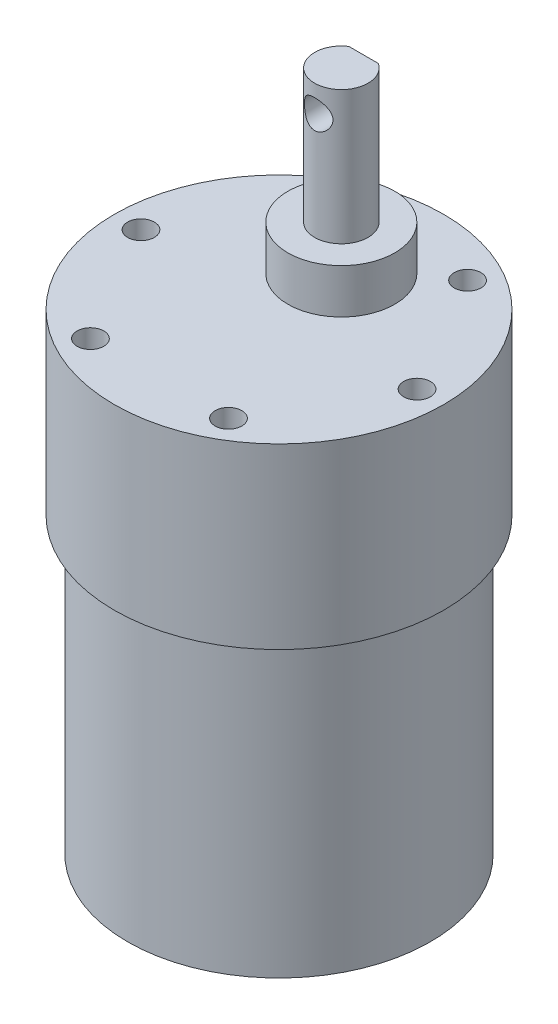
ISO-10303-21;
HEADER;
FILE_DESCRIPTION(('STEP AP214'),'2;1');
FILE_NAME('part.step','',(''),(''),'','','');
FILE_SCHEMA(('AUTOMOTIVE_DESIGN { 1 0 10303 214 1 1 1 1 }'));
ENDSEC;
DATA;
#1=APPLICATION_CONTEXT('core data for automotive mechanical design processes');
#2=APPLICATION_PROTOCOL_DEFINITION('international standard','automotive_design',2000,#1);
#3=PRODUCT_CONTEXT('',#1,'mechanical');
#4=PRODUCT('Part','Part','',(#3));
#5=PRODUCT_RELATED_PRODUCT_CATEGORY('part','',(#4));
#6=PRODUCT_DEFINITION_FORMATION('','',#4);
#7=PRODUCT_DEFINITION_CONTEXT('part definition',#1,'design');
#8=PRODUCT_DEFINITION('design','',#6,#7);
#9=PRODUCT_DEFINITION_SHAPE('','',#8);
#10=(LENGTH_UNIT() NAMED_UNIT(*) SI_UNIT(.MILLI.,.METRE.));
#11=(NAMED_UNIT(*) PLANE_ANGLE_UNIT() SI_UNIT($,.RADIAN.));
#12=(NAMED_UNIT(*) SI_UNIT($,.STERADIAN.) SOLID_ANGLE_UNIT());
#13=UNCERTAINTY_MEASURE_WITH_UNIT(LENGTH_MEASURE(1.E-05),#10,'distance_accuracy_value','');
#14=(GEOMETRIC_REPRESENTATION_CONTEXT(3) GLOBAL_UNCERTAINTY_ASSIGNED_CONTEXT((#13)) GLOBAL_UNIT_ASSIGNED_CONTEXT((#10,
#11,#12)) REPRESENTATION_CONTEXT('',''));
#15=CARTESIAN_POINT('',(0.,0.,0.));
#16=DIRECTION('',(0.,0.,1.));
#17=DIRECTION('',(1.,0.,0.));
#18=AXIS2_PLACEMENT_3D('',#15,#16,#17);
#19=CARTESIAN_POINT('',(0.,33.,0.));
#20=DIRECTION('',(0.,-1.,0.));
#21=DIRECTION('',(0.,0.,-1.));
#22=AXIS2_PLACEMENT_3D('',#19,#20,#21);
#23=CYLINDRICAL_SURFACE('',#22,17.);
#24=CARTESIAN_POINT('',(0.,33.,0.));
#25=DIRECTION('',(0.,1.,0.));
#26=DIRECTION('',(0.,0.,1.));
#27=AXIS2_PLACEMENT_3D('',#24,#25,#26);
#28=CIRCLE('',#27,17.);
#29=CARTESIAN_POINT('',(0.,33.,17.));
#30=VERTEX_POINT('',#29);
#31=EDGE_CURVE('E84',#30,#30,#28,.T.);
#32=ORIENTED_EDGE('',*,*,#31,.F.);
#33=EDGE_LOOP('',(#32));
#34=FACE_BOUND('',#33,.T.);
#35=CARTESIAN_POINT('',(0.,0.,0.));
#36=DIRECTION('',(0.,1.,0.));
#37=DIRECTION('',(0.,0.,1.));
#38=AXIS2_PLACEMENT_3D('',#35,#36,#37);
#39=CIRCLE('',#38,17.);
#40=CARTESIAN_POINT('',(0.,0.,17.));
#41=VERTEX_POINT('',#40);
#42=EDGE_CURVE('E36',#41,#41,#39,.T.);
#43=ORIENTED_EDGE('',*,*,#42,.T.);
#44=EDGE_LOOP('',(#43));
#45=FACE_BOUND('',#44,.T.);
#46=ADVANCED_FACE('F33',(#34,#45),#23,.T.);
#47=CARTESIAN_POINT('',(0.,0.,0.));
#48=DIRECTION('',(0.,1.,0.));
#49=DIRECTION('',(0.,0.,1.));
#50=AXIS2_PLACEMENT_3D('',#47,#48,#49);
#51=PLANE('',#50);
#52=ORIENTED_EDGE('',*,*,#42,.F.);
#53=EDGE_LOOP('',(#52));
#54=FACE_BOUND('',#53,.T.);
#55=ADVANCED_FACE('F96',(#54),#51,.F.);
#56=CARTESIAN_POINT('',(0.,53.,0.));
#57=DIRECTION('',(0.,-1.,0.));
#58=DIRECTION('',(0.,0.,-1.));
#59=AXIS2_PLACEMENT_3D('',#56,#57,#58);
#60=CYLINDRICAL_SURFACE('',#59,18.5);
#61=CARTESIAN_POINT('',(0.,53.,0.));
#62=DIRECTION('',(0.,1.,0.));
#63=DIRECTION('',(0.,0.,1.));
#64=AXIS2_PLACEMENT_3D('',#61,#62,#63);
#65=CIRCLE('',#64,18.5);
#66=CARTESIAN_POINT('',(0.,53.,18.5));
#67=VERTEX_POINT('',#66);
#68=EDGE_CURVE('E85',#67,#67,#65,.T.);
#69=ORIENTED_EDGE('',*,*,#68,.F.);
#70=EDGE_LOOP('',(#69));
#71=FACE_BOUND('',#70,.T.);
#72=CARTESIAN_POINT('',(0.,33.,0.));
#73=DIRECTION('',(0.,1.,0.));
#74=DIRECTION('',(0.,0.,1.));
#75=AXIS2_PLACEMENT_3D('',#72,#73,#74);
#76=CIRCLE('',#75,18.5);
#77=CARTESIAN_POINT('',(0.,33.,18.5));
#78=VERTEX_POINT('',#77);
#79=EDGE_CURVE('E78',#78,#78,#76,.T.);
#80=ORIENTED_EDGE('',*,*,#79,.T.);
#81=EDGE_LOOP('',(#80));
#82=FACE_BOUND('',#81,.T.);
#83=ADVANCED_FACE('F98',(#71,#82),#60,.T.);
#84=CARTESIAN_POINT('',(0.,53.,0.));
#85=DIRECTION('',(0.,1.,0.));
#86=DIRECTION('',(0.,0.,1.));
#87=AXIS2_PLACEMENT_3D('',#84,#85,#86);
#88=PLANE('',#87);
#89=CARTESIAN_POINT('',(15.5,53.,0.));
#90=DIRECTION('',(0.,1.,0.));
#91=DIRECTION('',(0.,0.,1.));
#92=AXIS2_PLACEMENT_3D('',#89,#90,#91);
#93=CIRCLE('',#92,1.5);
#94=CARTESIAN_POINT('',(15.5,53.,1.5));
#95=VERTEX_POINT('',#94);
#96=EDGE_CURVE('E360',#95,#95,#93,.T.);
#97=ORIENTED_EDGE('',*,*,#96,.F.);
#98=EDGE_LOOP('',(#97));
#99=FACE_BOUND('',#98,.T.);
#100=CARTESIAN_POINT('',(7.75000000000002,53.,-13.4233937586588));
#101=DIRECTION('',(0.,1.,0.));
#102=DIRECTION('',(0.,0.,1.));
#103=AXIS2_PLACEMENT_3D('',#100,#101,#102);
#104=CIRCLE('',#103,1.5);
#105=CARTESIAN_POINT('',(7.75000000000002,53.,-11.9233937586588));
#106=VERTEX_POINT('',#105);
#107=EDGE_CURVE('E135',#106,#106,#104,.T.);
#108=ORIENTED_EDGE('',*,*,#107,.F.);
#109=EDGE_LOOP('',(#108));
#110=FACE_BOUND('',#109,.T.);
#111=CARTESIAN_POINT('',(-15.5,53.,0.));
#112=DIRECTION('',(0.,1.,0.));
#113=DIRECTION('',(0.,0.,1.));
#114=AXIS2_PLACEMENT_3D('',#111,#112,#113);
#115=CIRCLE('',#114,1.5);
#116=CARTESIAN_POINT('',(-15.5,53.,1.5));
#117=VERTEX_POINT('',#116);
#118=EDGE_CURVE('E354',#117,#117,#115,.T.);
#119=ORIENTED_EDGE('',*,*,#118,.F.);
#120=EDGE_LOOP('',(#119));
#121=FACE_BOUND('',#120,.T.);
#122=CARTESIAN_POINT('',(-7.75000000000001,53.,13.4233937586588));
#123=DIRECTION('',(0.,1.,0.));
#124=DIRECTION('',(0.,0.,1.));
#125=AXIS2_PLACEMENT_3D('',#122,#123,#124);
#126=CIRCLE('',#125,1.5);
#127=CARTESIAN_POINT('',(-7.75000000000001,53.,14.9233937586588));
#128=VERTEX_POINT('',#127);
#129=EDGE_CURVE('E347',#128,#128,#126,.T.);
#130=ORIENTED_EDGE('',*,*,#129,.F.);
#131=EDGE_LOOP('',(#130));
#132=FACE_BOUND('',#131,.T.);
#133=CARTESIAN_POINT('',(7.75000000000002,53.,13.4233937586588));
#134=DIRECTION('',(0.,1.,0.));
#135=DIRECTION('',(0.,0.,1.));
#136=AXIS2_PLACEMENT_3D('',#133,#134,#135);
#137=CIRCLE('',#136,1.5);
#138=CARTESIAN_POINT('',(7.75000000000002,53.,14.9233937586588));
#139=VERTEX_POINT('',#138);
#140=EDGE_CURVE('E368',#139,#139,#137,.T.);
#141=ORIENTED_EDGE('',*,*,#140,.F.);
#142=EDGE_LOOP('',(#141));
#143=FACE_BOUND('',#142,.T.);
#144=CARTESIAN_POINT('',(-7.75000000000002,53.,-13.4233937586588));
#145=DIRECTION('',(0.,1.,0.));
#146=DIRECTION('',(0.,0.,1.));
#147=AXIS2_PLACEMENT_3D('',#144,#145,#146);
#148=CIRCLE('',#147,1.5);
#149=CARTESIAN_POINT('',(-7.75000000000002,53.,-11.9233937586588));
#150=VERTEX_POINT('',#149);
#151=EDGE_CURVE('E361',#150,#150,#148,.T.);
#152=ORIENTED_EDGE('',*,*,#151,.F.);
#153=EDGE_LOOP('',(#152));
#154=FACE_BOUND('',#153,.T.);
#155=CARTESIAN_POINT('',(0.,53.,-7.));
#156=DIRECTION('',(0.,1.,0.));
#157=DIRECTION('',(0.,0.,1.));
#158=AXIS2_PLACEMENT_3D('',#155,#156,#157);
#159=CIRCLE('',#158,6.);
#160=CARTESIAN_POINT('',(0.,53.,-0.999999999999999));
#161=VERTEX_POINT('',#160);
#162=EDGE_CURVE('E41',#161,#161,#159,.T.);
#163=ORIENTED_EDGE('',*,*,#162,.F.);
#164=EDGE_LOOP('',(#163));
#165=FACE_BOUND('',#164,.T.);
#166=ORIENTED_EDGE('',*,*,#68,.T.);
#167=EDGE_LOOP('',(#166));
#168=FACE_BOUND('',#167,.T.);
#169=ADVANCED_FACE('F103',(#99,#110,#121,#132,#143,#154,#165,#168),#88,.T.);
#170=CARTESIAN_POINT('',(0.,33.,0.));
#171=DIRECTION('',(0.,1.,0.));
#172=DIRECTION('',(0.,0.,1.));
#173=AXIS2_PLACEMENT_3D('',#170,#171,#172);
#174=PLANE('',#173);
#175=ORIENTED_EDGE('',*,*,#31,.T.);
#176=EDGE_LOOP('',(#175));
#177=FACE_BOUND('',#176,.T.);
#178=ORIENTED_EDGE('',*,*,#79,.F.);
#179=EDGE_LOOP('',(#178));
#180=FACE_BOUND('',#179,.T.);
#181=ADVANCED_FACE('F108',(#177,#180),#174,.F.);
#182=CARTESIAN_POINT('',(0.,58.,-7.));
#183=DIRECTION('',(0.,-1.,0.));
#184=DIRECTION('',(0.,0.,-1.));
#185=AXIS2_PLACEMENT_3D('',#182,#183,#184);
#186=CYLINDRICAL_SURFACE('',#185,6.);
#187=CARTESIAN_POINT('',(0.,58.,-7.));
#188=DIRECTION('',(0.,1.,0.));
#189=DIRECTION('',(0.,0.,1.));
#190=AXIS2_PLACEMENT_3D('',#187,#188,#189);
#191=CIRCLE('',#190,6.);
#192=CARTESIAN_POINT('',(0.,58.,-0.999999999999999));
#193=VERTEX_POINT('',#192);
#194=EDGE_CURVE('E75',#193,#193,#191,.T.);
#195=ORIENTED_EDGE('',*,*,#194,.F.);
#196=EDGE_LOOP('',(#195));
#197=FACE_BOUND('',#196,.T.);
#198=ORIENTED_EDGE('',*,*,#162,.T.);
#199=EDGE_LOOP('',(#198));
#200=FACE_BOUND('',#199,.T.);
#201=ADVANCED_FACE('F111',(#197,#200),#186,.T.);
#202=CARTESIAN_POINT('',(0.,58.,-7.));
#203=DIRECTION('',(0.,1.,0.));
#204=DIRECTION('',(0.,0.,1.));
#205=AXIS2_PLACEMENT_3D('',#202,#203,#204);
#206=PLANE('',#205);
#207=CARTESIAN_POINT('',(0.,58.,-7.));
#208=DIRECTION('',(0.,1.,0.));
#209=DIRECTION('',(0.,0.,1.));
#210=AXIS2_PLACEMENT_3D('',#207,#208,#209);
#211=CIRCLE('',#210,3.);
#212=CARTESIAN_POINT('',(0.,58.,-4.));
#213=VERTEX_POINT('',#212);
#214=EDGE_CURVE('E11',#213,#213,#211,.T.);
#215=ORIENTED_EDGE('',*,*,#214,.F.);
#216=EDGE_LOOP('',(#215));
#217=FACE_BOUND('',#216,.T.);
#218=ORIENTED_EDGE('',*,*,#194,.T.);
#219=EDGE_LOOP('',(#218));
#220=FACE_BOUND('',#219,.T.);
#221=ADVANCED_FACE('F117',(#217,#220),#206,.T.);
#222=CARTESIAN_POINT('',(0.,73.,-7.));
#223=DIRECTION('',(0.,-1.,0.));
#224=DIRECTION('',(0.,0.,-1.));
#225=AXIS2_PLACEMENT_3D('',#222,#223,#224);
#226=CYLINDRICAL_SURFACE('',#225,3.);
#227=CARTESIAN_POINT('',(-1.6,70.,-4.4622844919101));
#228=CARTESIAN_POINT('',(-1.59999372902864,70.0824745310707,-4.46227606593636));
#229=CARTESIAN_POINT('',(-1.59357932983777,70.1650325651954,-4.45820110732961));
#230=CARTESIAN_POINT('',(-1.56828258203232,70.327541634721,-4.44252157191309));
#231=CARTESIAN_POINT('',(-1.54937754703877,70.4074876481904,-4.43090329505966));
#232=CARTESIAN_POINT('',(-1.50019479249203,70.562104398563,-4.40188191606213));
#233=CARTESIAN_POINT('',(-1.46998426801955,70.6368032665812,-4.38451306189285));
#234=CARTESIAN_POINT('',(-1.39925451330502,70.7800484611148,-4.34600225606002));
#235=CARTESIAN_POINT('',(-1.3587336117439,70.8485937876976,-4.32485969284171));
#236=CARTESIAN_POINT('',(-1.26404750373261,70.9847297419108,-4.27874882981922));
#237=CARTESIAN_POINT('',(-1.20895416004221,71.0516165992477,-4.25360782392457));
#238=CARTESIAN_POINT('',(-1.08860845760442,71.17575988945,-4.20372079636657));
#239=CARTESIAN_POINT('',(-1.02335042944416,71.2330109105686,-4.17897500367978));
#240=CARTESIAN_POINT('',(-0.878216095721796,71.3407200771568,-4.13032403319342));
#241=CARTESIAN_POINT('',(-0.797590815734636,71.3902790805465,-4.10664126329641));
#242=CARTESIAN_POINT('',(-0.627645549869449,71.4748040470449,-4.0650912982932));
#243=CARTESIAN_POINT('',(-0.538331852815009,71.5097804697595,-4.04721993688631));
#244=CARTESIAN_POINT('',(-0.361029029201844,71.5612467068467,-4.02056257181841));
#245=CARTESIAN_POINT('',(-0.273494411235111,71.5789804396012,-4.01116950773183));
#246=CARTESIAN_POINT('',(-0.0962309461098286,71.5995889209847,-4.00023272750743));
#247=CARTESIAN_POINT('',(-0.00650368795728481,71.6024741272148,-3.99868348709127));
#248=CARTESIAN_POINT('',(0.163099999904372,71.5937037077839,-4.00335426147493));
#249=CARTESIAN_POINT('',(0.243075222391701,71.5834540683269,-4.00882312374151));
#250=CARTESIAN_POINT('',(0.39996993582674,71.5512696714488,-4.02573532302439));
#251=CARTESIAN_POINT('',(0.476889194090908,71.5293340260712,-4.03717911404194));
#252=CARTESIAN_POINT('',(0.626696643763508,71.474346935919,-4.06518582727855));
#253=CARTESIAN_POINT('',(0.699525429708883,71.4411653390539,-4.08180849513014));
#254=CARTESIAN_POINT('',(0.838736612142144,71.3648549557721,-4.11873033197212));
#255=CARTESIAN_POINT('',(0.905116834884373,71.3217228315536,-4.13903073412885));
#256=CARTESIAN_POINT('',(1.03689401245649,71.2216332900374,-4.18394182627969));
#257=CARTESIAN_POINT('',(1.10147714320615,71.1637066732498,-4.20878117514446));
#258=CARTESIAN_POINT('',(1.22048082664393,71.0382268411844,-4.25872289535747));
#259=CARTESIAN_POINT('',(1.27489171384595,70.9706645766368,-4.28382549316751));
#260=CARTESIAN_POINT('',(1.37628547852478,70.8213472159821,-4.33367712751939));
#261=CARTESIAN_POINT('',(1.4223379371139,70.7388916630617,-4.35824048100066));
#262=CARTESIAN_POINT('',(1.49959087550646,70.5658428177804,-4.40130801389356));
#263=CARTESIAN_POINT('',(1.53080819917999,70.4752588940559,-4.4198190576318));
#264=CARTESIAN_POINT('',(1.57482918610285,70.2961542721075,-4.4464669588985));
#265=CARTESIAN_POINT('',(1.58892130462437,70.208062442984,-4.45532364951042));
#266=CARTESIAN_POINT('',(1.60218459192319,70.0303556608172,-4.46364858709568));
#267=CARTESIAN_POINT('',(1.60137022914037,69.9407422690426,-4.46312593779759));
#268=CARTESIAN_POINT('',(1.5860251531198,69.7752780681522,-4.45351706818926));
#269=CARTESIAN_POINT('',(1.57332778120755,69.6991781597307,-4.44557571348809));
#270=CARTESIAN_POINT('',(1.5374331358097,69.5503776258114,-4.42381355112763));
#271=CARTESIAN_POINT('',(1.51423174573272,69.4776783453774,-4.40999043849794));
#272=CARTESIAN_POINT('',(1.45695779214085,69.3340269086467,-4.37732943135093));
#273=CARTESIAN_POINT('',(1.4224493034941,69.2632946958579,-4.35829656791045));
#274=CARTESIAN_POINT('',(1.34390586859305,69.1282031846362,-4.31748714593598));
#275=CARTESIAN_POINT('',(1.29986607575593,69.0638471527943,-4.29570919391035));
#276=CARTESIAN_POINT('',(1.19596121370111,68.9334106691622,-4.24801864253813));
#277=CARTESIAN_POINT('',(1.13472097029284,68.868470481961,-4.22196925709605));
#278=CARTESIAN_POINT('',(1.00193372332187,68.749365224325,-4.17136446704702));
#279=CARTESIAN_POINT('',(0.930381635050941,68.695205501229,-4.146809808027));
#280=CARTESIAN_POINT('',(0.775115096617048,68.5971582244781,-4.10068717557643));
#281=CARTESIAN_POINT('',(0.69101877168908,68.5537911148337,-4.07928573571956));
#282=CARTESIAN_POINT('',(0.51525707549454,68.4822759197313,-4.04322341884292));
#283=CARTESIAN_POINT('',(0.423599295249482,68.4541127801245,-4.02855587644314));
#284=CARTESIAN_POINT('',(0.245085247888815,68.4165182539726,-4.00881495633581));
#285=CARTESIAN_POINT('',(0.158650200440578,68.4055101959829,-4.00293640039446));
#286=CARTESIAN_POINT('',(-0.0150269330897048,68.3977144966021,-3.99878281513462));
#287=CARTESIAN_POINT('',(-0.10226862958652,68.4009203152223,-4.00050428894239));
#288=CARTESIAN_POINT('',(-0.267577989158693,68.4205169304725,-4.01090158099972));
#289=CARTESIAN_POINT('',(-0.345815720280643,68.4358169571471,-4.01900187732497));
#290=CARTESIAN_POINT('',(-0.498443755728398,68.4775625709016,-4.04069291686697));
#291=CARTESIAN_POINT('',(-0.572833571621197,68.5040095690374,-4.05428435517902));
#292=CARTESIAN_POINT('',(-0.71885177889575,68.5682681173746,-4.08640195314005));
#293=CARTESIAN_POINT('',(-0.790270251834192,68.6064706155066,-4.10509487328471));
#294=CARTESIAN_POINT('',(-0.925942643728962,68.6926752042186,-4.14559096713447));
#295=CARTESIAN_POINT('',(-0.990193456262653,68.7406815183993,-4.16739548012715));
#296=CARTESIAN_POINT('',(-1.11721494450397,68.8512263964159,-4.2148754794868));
#297=CARTESIAN_POINT('',(-1.1790401452611,68.9147839528241,-4.24071262645152));
#298=CARTESIAN_POINT('',(-1.29157988795468,69.0514912226831,-4.29156054521478));
#299=CARTESIAN_POINT('',(-1.34228215838383,69.1246513895682,-4.31657037870291));
#300=CARTESIAN_POINT('',(-1.43366897954619,69.28345710945,-4.36420949156943));
#301=CARTESIAN_POINT('',(-1.47366570008067,69.3695632495797,-4.38663761193233));
#302=CARTESIAN_POINT('',(-1.53799938953918,69.54882972109,-4.42396230917702));
#303=CARTESIAN_POINT('',(-1.5623875780355,69.6419658468573,-4.43888348533832));
#304=CARTESIAN_POINT('',(-1.58544926946728,69.7802480124104,-4.45315665775179));
#305=CARTESIAN_POINT('',(-1.59089425785167,69.8239408975559,-4.45656260671016));
#306=CARTESIAN_POINT('',(-1.59817136921368,69.9117478725976,-4.46112882077275));
#307=CARTESIAN_POINT('',(-1.60000335604539,69.9558619783034,-4.46228900125143));
#308=CARTESIAN_POINT('',(-1.6,70.,-4.4622844919101));
#309=B_SPLINE_CURVE_WITH_KNOTS('',3,(#227,#228,#229,#230,#231,#232,#233,#234,#235,#236,#237,
#238,#239,#240,#241,#242,#243,#244,#245,#246,#247,#248,#249,#250,#251,#252,#253,#254,#255,#256,
#257,#258,#259,#260,#261,#262,#263,#264,#265,#266,#267,#268,#269,#270,#271,#272,#273,#274,#275,
#276,#277,#278,#279,#280,#281,#282,#283,#284,#285,#286,#287,#288,#289,#290,#291,#292,#293,#294,
#295,#296,#297,#298,#299,#300,#301,#302,#303,#304,#305,#306,#307,#308),.UNSPECIFIED.,.T.,.F.,(4,
2,2,2,2,2,2,2,2,2,2,2,2,2,2,2,2,2,2,2,2,2,2,2,2,2,2,2,2,2,2,2,2,2,2,2,2,2,2,2,4),(0.,
0.247236947174773,0.494924182632619,0.741162065387772,0.987439888926957,1.25701617256929,
1.52674335596952,1.81786745875614,2.10878238705001,2.37667542174064,2.64437975742193,
2.8856825051537,3.12700359079373,3.37121873440959,3.61551591689506,3.88511401850532,
4.15496699977609,4.44620613475034,4.73711380091719,5.0044194780885,5.27146571838899,
5.50309713228815,5.73481940269528,5.97680341191488,6.21891075815248,6.49665128670816,
6.77452923901579,7.06395553861634,7.35309473588114,7.61364749838935,7.87408038963907,
8.11338489734174,8.35271970686212,8.60107981850485,8.84954715321508,9.12542892067873,
9.40161354419164,9.69269476285078,9.98281583025839,10.1151250220935,10.2474391995363),.UNSPECIFIED.);
#310=CARTESIAN_POINT('',(-1.6,70.,-4.4622844919101));
#311=VERTEX_POINT('',#310);
#312=EDGE_CURVE('E128',#311,#311,#309,.T.);
#313=ORIENTED_EDGE('',*,*,#312,.T.);
#314=EDGE_LOOP('',(#313));
#315=FACE_BOUND('',#314,.T.);
#316=CARTESIAN_POINT('',(0.,73.,-7.));
#317=DIRECTION('',(0.,1.,0.));
#318=DIRECTION('',(0.,0.,1.));
#319=AXIS2_PLACEMENT_3D('',#316,#317,#318);
#320=CIRCLE('',#319,3.);
#321=CARTESIAN_POINT('',(-1.6583123951777,73.,-9.5));
#322=VERTEX_POINT('',#321);
#323=CARTESIAN_POINT('',(1.6583123951777,73.,-9.5));
#324=VERTEX_POINT('',#323);
#325=EDGE_CURVE('E72',#322,#324,#320,.T.);
#326=ORIENTED_EDGE('',*,*,#325,.F.);
#327=DIRECTION('',(0.,1.,0.));
#328=VECTOR('',#327,1.);
#329=CARTESIAN_POINT('',(-1.6583123951777,59.,-9.5));
#330=LINE('',#329,#328);
#331=CARTESIAN_POINT('',(-1.6583123951777,59.,-9.5));
#332=VERTEX_POINT('',#331);
#333=EDGE_CURVE('E49',#332,#322,#330,.T.);
#334=ORIENTED_EDGE('',*,*,#333,.F.);
#335=CARTESIAN_POINT('',(0.,59.,-7.));
#336=DIRECTION('',(0.,1.,0.));
#337=DIRECTION('',(0.,0.,1.));
#338=AXIS2_PLACEMENT_3D('',#335,#336,#337);
#339=CIRCLE('',#338,3.);
#340=CARTESIAN_POINT('',(1.6583123951777,59.,-9.5));
#341=VERTEX_POINT('',#340);
#342=EDGE_CURVE('E65',#341,#332,#339,.T.);
#343=ORIENTED_EDGE('',*,*,#342,.F.);
#344=DIRECTION('',(0.,1.,0.));
#345=VECTOR('',#344,1.);
#346=CARTESIAN_POINT('',(1.6583123951777,59.,-9.5));
#347=LINE('',#346,#345);
#348=EDGE_CURVE('E55',#341,#324,#347,.T.);
#349=ORIENTED_EDGE('',*,*,#348,.T.);
#350=EDGE_LOOP('',(#326,#334,#343,#349));
#351=FACE_BOUND('',#350,.T.);
#352=ORIENTED_EDGE('',*,*,#214,.T.);
#353=EDGE_LOOP('',(#352));
#354=FACE_BOUND('',#353,.T.);
#355=ADVANCED_FACE('F70',(#315,#351,#354),#226,.T.);
#356=CARTESIAN_POINT('',(0.,73.,-7.));
#357=DIRECTION('',(0.,1.,0.));
#358=DIRECTION('',(0.,0.,1.));
#359=AXIS2_PLACEMENT_3D('',#356,#357,#358);
#360=PLANE('',#359);
#361=DIRECTION('',(1.,0.,0.));
#362=VECTOR('',#361,1.);
#363=CARTESIAN_POINT('',(0.,73.,-9.5));
#364=LINE('',#363,#362);
#365=EDGE_CURVE('E60',#322,#324,#364,.T.);
#366=ORIENTED_EDGE('',*,*,#365,.F.);
#367=ORIENTED_EDGE('',*,*,#325,.T.);
#368=EDGE_LOOP('',(#366,#367));
#369=FACE_BOUND('',#368,.T.);
#370=ADVANCED_FACE('F74',(#369),#360,.T.);
#371=CARTESIAN_POINT('',(0.,59.,-9.5));
#372=DIRECTION('',(0.,0.,1.));
#373=DIRECTION('',(1.,0.,0.));
#374=AXIS2_PLACEMENT_3D('',#371,#372,#373);
#375=PLANE('',#374);
#376=CARTESIAN_POINT('',(0.,70.,-9.5));
#377=DIRECTION('',(0.,0.,-1.));
#378=DIRECTION('',(-1.,0.,0.));
#379=AXIS2_PLACEMENT_3D('',#376,#377,#378);
#380=CIRCLE('',#379,1.6);
#381=CARTESIAN_POINT('',(-1.6,70.,-9.5));
#382=VERTEX_POINT('',#381);
#383=EDGE_CURVE('E136',#382,#382,#380,.T.);
#384=ORIENTED_EDGE('',*,*,#383,.F.);
#385=EDGE_LOOP('',(#384));
#386=FACE_BOUND('',#385,.T.);
#387=ORIENTED_EDGE('',*,*,#365,.T.);
#388=ORIENTED_EDGE('',*,*,#348,.F.);
#389=DIRECTION('',(1.,0.,0.));
#390=VECTOR('',#389,1.);
#391=CARTESIAN_POINT('',(0.,59.,-9.5));
#392=LINE('',#391,#390);
#393=EDGE_CURVE('E343',#332,#341,#392,.T.);
#394=ORIENTED_EDGE('',*,*,#393,.F.);
#395=ORIENTED_EDGE('',*,*,#333,.T.);
#396=EDGE_LOOP('',(#387,#388,#394,#395));
#397=FACE_BOUND('',#396,.T.);
#398=ADVANCED_FACE('F61',(#386,#397),#375,.F.);
#399=CARTESIAN_POINT('',(0.,59.,0.));
#400=DIRECTION('',(0.,1.,0.));
#401=DIRECTION('',(0.,0.,1.));
#402=AXIS2_PLACEMENT_3D('',#399,#400,#401);
#403=PLANE('',#402);
#404=ORIENTED_EDGE('',*,*,#342,.T.);
#405=ORIENTED_EDGE('',*,*,#393,.T.);
#406=EDGE_LOOP('',(#404,#405));
#407=FACE_BOUND('',#406,.T.);
#408=ADVANCED_FACE('F176',(#407),#403,.T.);
#409=CARTESIAN_POINT('',(-7.75000000000002,43.,-13.4233937586588));
#410=DIRECTION('',(0.,1.,0.));
#411=DIRECTION('',(0.,0.,1.));
#412=AXIS2_PLACEMENT_3D('',#409,#410,#411);
#413=CYLINDRICAL_SURFACE('',#412,1.5);
#414=CARTESIAN_POINT('',(-7.75000000000002,43.,-13.4233937586588));
#415=DIRECTION('',(0.,1.,0.));
#416=DIRECTION('',(0.,0.,1.));
#417=AXIS2_PLACEMENT_3D('',#414,#415,#416);
#418=CIRCLE('',#417,1.5);
#419=CARTESIAN_POINT('',(-7.75000000000002,43.,-11.9233937586588));
#420=VERTEX_POINT('',#419);
#421=EDGE_CURVE('E364',#420,#420,#418,.T.);
#422=ORIENTED_EDGE('',*,*,#421,.F.);
#423=EDGE_LOOP('',(#422));
#424=FACE_BOUND('',#423,.T.);
#425=ORIENTED_EDGE('',*,*,#151,.T.);
#426=EDGE_LOOP('',(#425));
#427=FACE_BOUND('',#426,.T.);
#428=ADVANCED_FACE('F172',(#424,#427),#413,.F.);
#429=CARTESIAN_POINT('',(-7.75000000000002,43.,-13.4233937586588));
#430=DIRECTION('',(0.,1.,0.));
#431=DIRECTION('',(0.,0.,1.));
#432=AXIS2_PLACEMENT_3D('',#429,#430,#431);
#433=PLANE('',#432);
#434=ORIENTED_EDGE('',*,*,#421,.T.);
#435=EDGE_LOOP('',(#434));
#436=FACE_BOUND('',#435,.T.);
#437=ADVANCED_FACE('F168',(#436),#433,.T.);
#438=CARTESIAN_POINT('',(7.75000000000002,43.,13.4233937586588));
#439=DIRECTION('',(0.,1.,0.));
#440=DIRECTION('',(0.,0.,1.));
#441=AXIS2_PLACEMENT_3D('',#438,#439,#440);
#442=CYLINDRICAL_SURFACE('',#441,1.5);
#443=CARTESIAN_POINT('',(7.75000000000002,43.,13.4233937586588));
#444=DIRECTION('',(0.,1.,0.));
#445=DIRECTION('',(0.,0.,1.));
#446=AXIS2_PLACEMENT_3D('',#443,#444,#445);
#447=CIRCLE('',#446,1.5);
#448=CARTESIAN_POINT('',(7.75000000000002,43.,14.9233937586588));
#449=VERTEX_POINT('',#448);
#450=EDGE_CURVE('E351',#449,#449,#447,.T.);
#451=ORIENTED_EDGE('',*,*,#450,.F.);
#452=EDGE_LOOP('',(#451));
#453=FACE_BOUND('',#452,.T.);
#454=ORIENTED_EDGE('',*,*,#140,.T.);
#455=EDGE_LOOP('',(#454));
#456=FACE_BOUND('',#455,.T.);
#457=ADVANCED_FACE('F164',(#453,#456),#442,.F.);
#458=CARTESIAN_POINT('',(7.75000000000002,43.,13.4233937586588));
#459=DIRECTION('',(0.,1.,0.));
#460=DIRECTION('',(0.,0.,1.));
#461=AXIS2_PLACEMENT_3D('',#458,#459,#460);
#462=PLANE('',#461);
#463=ORIENTED_EDGE('',*,*,#450,.T.);
#464=EDGE_LOOP('',(#463));
#465=FACE_BOUND('',#464,.T.);
#466=ADVANCED_FACE('F160',(#465),#462,.T.);
#467=CARTESIAN_POINT('',(-7.75000000000001,43.,13.4233937586588));
#468=DIRECTION('',(0.,1.,0.));
#469=DIRECTION('',(0.,0.,1.));
#470=AXIS2_PLACEMENT_3D('',#467,#468,#469);
#471=CYLINDRICAL_SURFACE('',#470,1.5);
#472=CARTESIAN_POINT('',(-7.75000000000001,43.,13.4233937586588));
#473=DIRECTION('',(0.,1.,0.));
#474=DIRECTION('',(0.,0.,1.));
#475=AXIS2_PLACEMENT_3D('',#472,#473,#474);
#476=CIRCLE('',#475,1.5);
#477=CARTESIAN_POINT('',(-7.75000000000001,43.,14.9233937586588));
#478=VERTEX_POINT('',#477);
#479=EDGE_CURVE('E350',#478,#478,#476,.T.);
#480=ORIENTED_EDGE('',*,*,#479,.F.);
#481=EDGE_LOOP('',(#480));
#482=FACE_BOUND('',#481,.T.);
#483=ORIENTED_EDGE('',*,*,#129,.T.);
#484=EDGE_LOOP('',(#483));
#485=FACE_BOUND('',#484,.T.);
#486=ADVANCED_FACE('F163',(#482,#485),#471,.F.);
#487=CARTESIAN_POINT('',(-7.75000000000001,43.,13.4233937586588));
#488=DIRECTION('',(0.,1.,0.));
#489=DIRECTION('',(0.,0.,1.));
#490=AXIS2_PLACEMENT_3D('',#487,#488,#489);
#491=PLANE('',#490);
#492=ORIENTED_EDGE('',*,*,#479,.T.);
#493=EDGE_LOOP('',(#492));
#494=FACE_BOUND('',#493,.T.);
#495=ADVANCED_FACE('F184',(#494),#491,.T.);
#496=CARTESIAN_POINT('',(-15.5,43.,0.));
#497=DIRECTION('',(0.,1.,0.));
#498=DIRECTION('',(0.,0.,1.));
#499=AXIS2_PLACEMENT_3D('',#496,#497,#498);
#500=CYLINDRICAL_SURFACE('',#499,1.5);
#501=CARTESIAN_POINT('',(-15.5,43.,0.));
#502=DIRECTION('',(0.,1.,0.));
#503=DIRECTION('',(0.,0.,1.));
#504=AXIS2_PLACEMENT_3D('',#501,#502,#503);
#505=CIRCLE('',#504,1.5);
#506=CARTESIAN_POINT('',(-15.5,43.,1.5));
#507=VERTEX_POINT('',#506);
#508=EDGE_CURVE('E357',#507,#507,#505,.T.);
#509=ORIENTED_EDGE('',*,*,#508,.F.);
#510=EDGE_LOOP('',(#509));
#511=FACE_BOUND('',#510,.T.);
#512=ORIENTED_EDGE('',*,*,#118,.T.);
#513=EDGE_LOOP('',(#512));
#514=FACE_BOUND('',#513,.T.);
#515=ADVANCED_FACE('F180',(#511,#514),#500,.F.);
#516=CARTESIAN_POINT('',(-15.5,43.,0.));
#517=DIRECTION('',(0.,1.,0.));
#518=DIRECTION('',(0.,0.,1.));
#519=AXIS2_PLACEMENT_3D('',#516,#517,#518);
#520=PLANE('',#519);
#521=ORIENTED_EDGE('',*,*,#508,.T.);
#522=EDGE_LOOP('',(#521));
#523=FACE_BOUND('',#522,.T.);
#524=ADVANCED_FACE('F158',(#523),#520,.T.);
#525=CARTESIAN_POINT('',(7.75000000000002,43.,-13.4233937586588));
#526=DIRECTION('',(0.,1.,0.));
#527=DIRECTION('',(0.,0.,1.));
#528=AXIS2_PLACEMENT_3D('',#525,#526,#527);
#529=CYLINDRICAL_SURFACE('',#528,1.5);
#530=CARTESIAN_POINT('',(7.75000000000002,43.,-13.4233937586588));
#531=DIRECTION('',(0.,1.,0.));
#532=DIRECTION('',(0.,0.,1.));
#533=AXIS2_PLACEMENT_3D('',#530,#531,#532);
#534=CIRCLE('',#533,1.5);
#535=CARTESIAN_POINT('',(7.75000000000002,43.,-11.9233937586588));
#536=VERTEX_POINT('',#535);
#537=EDGE_CURVE('E365',#536,#536,#534,.T.);
#538=ORIENTED_EDGE('',*,*,#537,.F.);
#539=EDGE_LOOP('',(#538));
#540=FACE_BOUND('',#539,.T.);
#541=ORIENTED_EDGE('',*,*,#107,.T.);
#542=EDGE_LOOP('',(#541));
#543=FACE_BOUND('',#542,.T.);
#544=ADVANCED_FACE('F154',(#540,#543),#529,.F.);
#545=CARTESIAN_POINT('',(7.75000000000002,43.,-13.4233937586588));
#546=DIRECTION('',(0.,1.,0.));
#547=DIRECTION('',(0.,0.,1.));
#548=AXIS2_PLACEMENT_3D('',#545,#546,#547);
#549=PLANE('',#548);
#550=ORIENTED_EDGE('',*,*,#537,.T.);
#551=EDGE_LOOP('',(#550));
#552=FACE_BOUND('',#551,.T.);
#553=ADVANCED_FACE('F150',(#552),#549,.T.);
#554=CARTESIAN_POINT('',(15.5,43.,0.));
#555=DIRECTION('',(0.,1.,0.));
#556=DIRECTION('',(0.,0.,1.));
#557=AXIS2_PLACEMENT_3D('',#554,#555,#556);
#558=CYLINDRICAL_SURFACE('',#557,1.5);
#559=CARTESIAN_POINT('',(15.5,43.,0.));
#560=DIRECTION('',(0.,1.,0.));
#561=DIRECTION('',(0.,0.,1.));
#562=AXIS2_PLACEMENT_3D('',#559,#560,#561);
#563=CIRCLE('',#562,1.5);
#564=CARTESIAN_POINT('',(15.5,43.,1.5));
#565=VERTEX_POINT('',#564);
#566=EDGE_CURVE('E66',#565,#565,#563,.T.);
#567=ORIENTED_EDGE('',*,*,#566,.F.);
#568=EDGE_LOOP('',(#567));
#569=FACE_BOUND('',#568,.T.);
#570=ORIENTED_EDGE('',*,*,#96,.T.);
#571=EDGE_LOOP('',(#570));
#572=FACE_BOUND('',#571,.T.);
#573=ADVANCED_FACE('F146',(#569,#572),#558,.F.);
#574=CARTESIAN_POINT('',(15.5,43.,0.));
#575=DIRECTION('',(0.,1.,0.));
#576=DIRECTION('',(0.,0.,1.));
#577=AXIS2_PLACEMENT_3D('',#574,#575,#576);
#578=PLANE('',#577);
#579=ORIENTED_EDGE('',*,*,#566,.T.);
#580=EDGE_LOOP('',(#579));
#581=FACE_BOUND('',#580,.T.);
#582=ADVANCED_FACE('F142',(#581),#578,.T.);
#583=CARTESIAN_POINT('',(0.,70.,0.5));
#584=DIRECTION('',(0.,0.,-1.));
#585=DIRECTION('',(-1.,0.,0.));
#586=AXIS2_PLACEMENT_3D('',#583,#584,#585);
#587=CYLINDRICAL_SURFACE('',#586,1.6);
#588=ORIENTED_EDGE('',*,*,#383,.T.);
#589=EDGE_LOOP('',(#588));
#590=FACE_BOUND('',#589,.T.);
#591=ORIENTED_EDGE('',*,*,#312,.F.);
#592=EDGE_LOOP('',(#591));
#593=FACE_BOUND('',#592,.T.);
#594=ADVANCED_FACE('F138',(#590,#593),#587,.F.);
#595=CLOSED_SHELL('',(#46,#55,#83,#169,#181,#201,#221,#355,#370,#398,#408,#428,#437,#457,#466,
#486,#495,#515,#524,#544,#553,#573,#582,#594));
#596=MANIFOLD_SOLID_BREP('B2',#595);
#597=ADVANCED_BREP_SHAPE_REPRESENTATION('',(#18,#596),#14);
#598=SHAPE_DEFINITION_REPRESENTATION(#9,#597);
ENDSEC;
END-ISO-10303-21;
